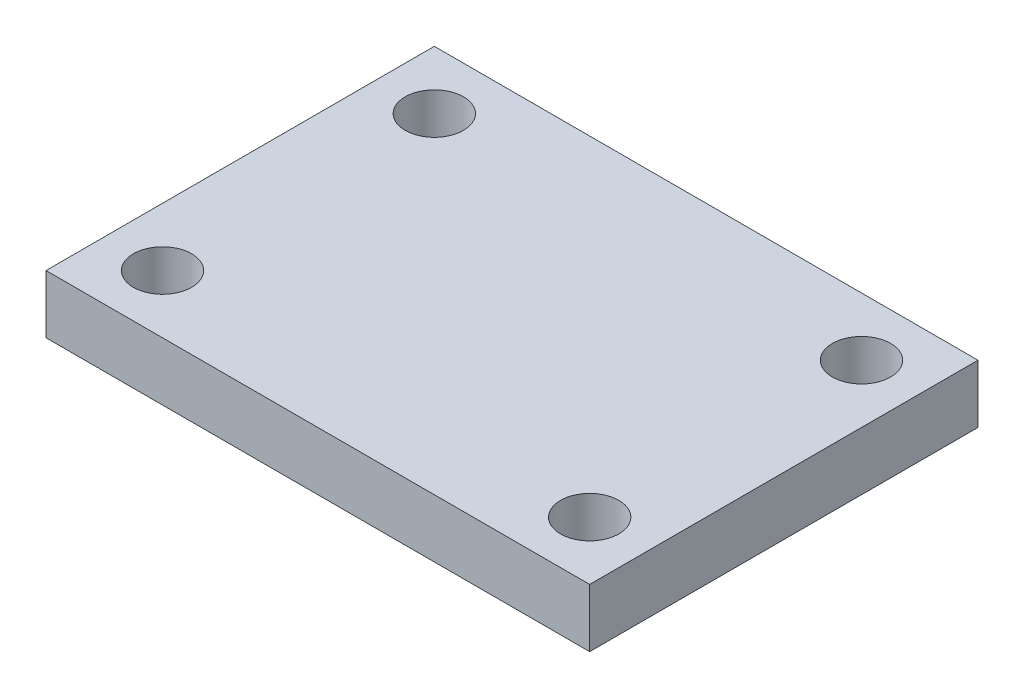
ISO-10303-21;
HEADER;
FILE_DESCRIPTION(('STEP AP214'),'2;1');
FILE_NAME('part.step','',(''),(''),'','','');
FILE_SCHEMA(('AUTOMOTIVE_DESIGN { 1 0 10303 214 1 1 1 1 }'));
ENDSEC;
DATA;
#1=APPLICATION_CONTEXT('core data for automotive mechanical design processes');
#2=APPLICATION_PROTOCOL_DEFINITION('international standard','automotive_design',2000,#1);
#3=PRODUCT_CONTEXT('',#1,'mechanical');
#4=PRODUCT('Part','Part','',(#3));
#5=PRODUCT_RELATED_PRODUCT_CATEGORY('part','',(#4));
#6=PRODUCT_DEFINITION_FORMATION('','',#4);
#7=PRODUCT_DEFINITION_CONTEXT('part definition',#1,'design');
#8=PRODUCT_DEFINITION('design','',#6,#7);
#9=PRODUCT_DEFINITION_SHAPE('','',#8);
#10=(LENGTH_UNIT() NAMED_UNIT(*) SI_UNIT(.MILLI.,.METRE.));
#11=(NAMED_UNIT(*) PLANE_ANGLE_UNIT() SI_UNIT($,.RADIAN.));
#12=(NAMED_UNIT(*) SI_UNIT($,.STERADIAN.) SOLID_ANGLE_UNIT());
#13=UNCERTAINTY_MEASURE_WITH_UNIT(LENGTH_MEASURE(1.E-05),#10,'distance_accuracy_value','');
#14=(GEOMETRIC_REPRESENTATION_CONTEXT(3) GLOBAL_UNCERTAINTY_ASSIGNED_CONTEXT((#13)) GLOBAL_UNIT_ASSIGNED_CONTEXT((#10,
#11,#12)) REPRESENTATION_CONTEXT('',''));
#15=CARTESIAN_POINT('',(0.,0.,0.));
#16=DIRECTION('',(0.,0.,1.));
#17=DIRECTION('',(1.,0.,0.));
#18=AXIS2_PLACEMENT_3D('',#15,#16,#17);
#19=CARTESIAN_POINT('',(0.,3.,0.));
#20=DIRECTION('',(0.,1.,0.));
#21=DIRECTION('',(0.,0.,1.));
#22=AXIS2_PLACEMENT_3D('',#19,#20,#21);
#23=PLANE('',#22);
#24=CARTESIAN_POINT('',(11.,3.,7.));
#25=DIRECTION('',(0.,1.,0.));
#26=DIRECTION('',(0.,0.,-1.));
#27=AXIS2_PLACEMENT_3D('',#24,#25,#26);
#28=CIRCLE('',#27,1.5);
#29=CARTESIAN_POINT('',(11.,3.,5.5));
#30=VERTEX_POINT('',#29);
#31=EDGE_CURVE('E146',#30,#30,#28,.T.);
#32=ORIENTED_EDGE('',*,*,#31,.F.);
#33=EDGE_LOOP('',(#32));
#34=FACE_BOUND('',#33,.T.);
#35=CARTESIAN_POINT('',(-11.,3.,-7.));
#36=DIRECTION('',(0.,1.,0.));
#37=DIRECTION('',(0.,0.,1.));
#38=AXIS2_PLACEMENT_3D('',#35,#36,#37);
#39=CIRCLE('',#38,1.5);
#40=CARTESIAN_POINT('',(-11.,3.,-5.5));
#41=VERTEX_POINT('',#40);
#42=EDGE_CURVE('E116',#41,#41,#39,.T.);
#43=ORIENTED_EDGE('',*,*,#42,.F.);
#44=EDGE_LOOP('',(#43));
#45=FACE_BOUND('',#44,.T.);
#46=DIRECTION('',(0.,0.,1.));
#47=VECTOR('',#46,1.);
#48=CARTESIAN_POINT('',(-14.,3.,10.));
#49=LINE('',#48,#47);
#50=CARTESIAN_POINT('',(-14.,3.,-10.));
#51=VERTEX_POINT('',#50);
#52=CARTESIAN_POINT('',(-14.,3.,10.));
#53=VERTEX_POINT('',#52);
#54=EDGE_CURVE('E96',#51,#53,#49,.T.);
#55=ORIENTED_EDGE('',*,*,#54,.T.);
#56=DIRECTION('',(1.,0.,0.));
#57=VECTOR('',#56,1.);
#58=CARTESIAN_POINT('',(14.,3.,10.));
#59=LINE('',#58,#57);
#60=CARTESIAN_POINT('',(14.,3.,10.));
#61=VERTEX_POINT('',#60);
#62=EDGE_CURVE('E91',#53,#61,#59,.T.);
#63=ORIENTED_EDGE('',*,*,#62,.T.);
#64=DIRECTION('',(0.,0.,-1.));
#65=VECTOR('',#64,1.);
#66=CARTESIAN_POINT('',(14.,3.,10.));
#67=LINE('',#66,#65);
#68=CARTESIAN_POINT('',(14.,3.,-10.));
#69=VERTEX_POINT('',#68);
#70=EDGE_CURVE('E94',#61,#69,#67,.T.);
#71=ORIENTED_EDGE('',*,*,#70,.T.);
#72=DIRECTION('',(-1.,0.,0.));
#73=VECTOR('',#72,1.);
#74=CARTESIAN_POINT('',(14.,3.,-10.));
#75=LINE('',#74,#73);
#76=EDGE_CURVE('E61',#69,#51,#75,.T.);
#77=ORIENTED_EDGE('',*,*,#76,.T.);
#78=EDGE_LOOP('',(#55,#63,#71,#77));
#79=FACE_BOUND('',#78,.T.);
#80=CARTESIAN_POINT('',(-11.,3.,7.));
#81=DIRECTION('',(0.,1.,0.));
#82=DIRECTION('',(0.,0.,1.));
#83=AXIS2_PLACEMENT_3D('',#80,#81,#82);
#84=CIRCLE('',#83,1.5);
#85=CARTESIAN_POINT('',(-11.,3.,8.5));
#86=VERTEX_POINT('',#85);
#87=EDGE_CURVE('E138',#86,#86,#84,.T.);
#88=ORIENTED_EDGE('',*,*,#87,.F.);
#89=EDGE_LOOP('',(#88));
#90=FACE_BOUND('',#89,.T.);
#91=CARTESIAN_POINT('',(11.,3.,-7.));
#92=DIRECTION('',(0.,1.,0.));
#93=DIRECTION('',(0.,0.,-1.));
#94=AXIS2_PLACEMENT_3D('',#91,#92,#93);
#95=CIRCLE('',#94,1.5);
#96=CARTESIAN_POINT('',(11.,3.,-8.5));
#97=VERTEX_POINT('',#96);
#98=EDGE_CURVE('E154',#97,#97,#95,.T.);
#99=ORIENTED_EDGE('',*,*,#98,.F.);
#100=EDGE_LOOP('',(#99));
#101=FACE_BOUND('',#100,.T.);
#102=ADVANCED_FACE('F43',(#34,#45,#79,#90,#101),#23,.T.);
#103=CARTESIAN_POINT('',(0.,0.,0.));
#104=DIRECTION('',(0.,1.,0.));
#105=DIRECTION('',(0.,0.,1.));
#106=AXIS2_PLACEMENT_3D('',#103,#104,#105);
#107=PLANE('',#106);
#108=DIRECTION('',(0.,0.,1.));
#109=VECTOR('',#108,1.);
#110=CARTESIAN_POINT('',(-14.,0.,10.));
#111=LINE('',#110,#109);
#112=CARTESIAN_POINT('',(-14.,0.,-10.));
#113=VERTEX_POINT('',#112);
#114=CARTESIAN_POINT('',(-14.,0.,10.));
#115=VERTEX_POINT('',#114);
#116=EDGE_CURVE('E112',#113,#115,#111,.T.);
#117=ORIENTED_EDGE('',*,*,#116,.F.);
#118=DIRECTION('',(-1.,0.,0.));
#119=VECTOR('',#118,1.);
#120=CARTESIAN_POINT('',(14.,0.,-10.));
#121=LINE('',#120,#119);
#122=CARTESIAN_POINT('',(14.,0.,-10.));
#123=VERTEX_POINT('',#122);
#124=EDGE_CURVE('E84',#123,#113,#121,.T.);
#125=ORIENTED_EDGE('',*,*,#124,.F.);
#126=DIRECTION('',(0.,0.,-1.));
#127=VECTOR('',#126,1.);
#128=CARTESIAN_POINT('',(14.,0.,10.));
#129=LINE('',#128,#127);
#130=CARTESIAN_POINT('',(14.,0.,10.));
#131=VERTEX_POINT('',#130);
#132=EDGE_CURVE('E78',#131,#123,#129,.T.);
#133=ORIENTED_EDGE('',*,*,#132,.F.);
#134=DIRECTION('',(1.,0.,0.));
#135=VECTOR('',#134,1.);
#136=CARTESIAN_POINT('',(14.,0.,10.));
#137=LINE('',#136,#135);
#138=EDGE_CURVE('E101',#115,#131,#137,.T.);
#139=ORIENTED_EDGE('',*,*,#138,.F.);
#140=EDGE_LOOP('',(#117,#125,#133,#139));
#141=FACE_BOUND('',#140,.T.);
#142=CARTESIAN_POINT('',(-11.,0.,-7.));
#143=DIRECTION('',(0.,1.,0.));
#144=DIRECTION('',(0.,0.,1.));
#145=AXIS2_PLACEMENT_3D('',#142,#143,#144);
#146=CIRCLE('',#145,1.5);
#147=CARTESIAN_POINT('',(-11.,0.,-5.5));
#148=VERTEX_POINT('',#147);
#149=EDGE_CURVE('E134',#148,#148,#146,.T.);
#150=ORIENTED_EDGE('',*,*,#149,.T.);
#151=EDGE_LOOP('',(#150));
#152=FACE_BOUND('',#151,.T.);
#153=CARTESIAN_POINT('',(-11.,0.,7.));
#154=DIRECTION('',(0.,1.,0.));
#155=DIRECTION('',(0.,0.,1.));
#156=AXIS2_PLACEMENT_3D('',#153,#154,#155);
#157=CIRCLE('',#156,1.5);
#158=CARTESIAN_POINT('',(-11.,0.,8.5));
#159=VERTEX_POINT('',#158);
#160=EDGE_CURVE('E142',#159,#159,#157,.T.);
#161=ORIENTED_EDGE('',*,*,#160,.T.);
#162=EDGE_LOOP('',(#161));
#163=FACE_BOUND('',#162,.T.);
#164=CARTESIAN_POINT('',(11.,0.,7.));
#165=DIRECTION('',(0.,1.,0.));
#166=DIRECTION('',(0.,0.,-1.));
#167=AXIS2_PLACEMENT_3D('',#164,#165,#166);
#168=CIRCLE('',#167,1.5);
#169=CARTESIAN_POINT('',(11.,0.,5.5));
#170=VERTEX_POINT('',#169);
#171=EDGE_CURVE('E150',#170,#170,#168,.T.);
#172=ORIENTED_EDGE('',*,*,#171,.T.);
#173=EDGE_LOOP('',(#172));
#174=FACE_BOUND('',#173,.T.);
#175=CARTESIAN_POINT('',(11.,0.,-7.));
#176=DIRECTION('',(0.,1.,0.));
#177=DIRECTION('',(0.,0.,-1.));
#178=AXIS2_PLACEMENT_3D('',#175,#176,#177);
#179=CIRCLE('',#178,1.5);
#180=CARTESIAN_POINT('',(11.,0.,-8.5));
#181=VERTEX_POINT('',#180);
#182=EDGE_CURVE('E158',#181,#181,#179,.T.);
#183=ORIENTED_EDGE('',*,*,#182,.T.);
#184=EDGE_LOOP('',(#183));
#185=FACE_BOUND('',#184,.T.);
#186=ADVANCED_FACE('F129',(#141,#152,#163,#174,#185),#107,.F.);
#187=CARTESIAN_POINT('',(-14.,3.,10.));
#188=DIRECTION('',(1.,0.,0.));
#189=DIRECTION('',(0.,0.,-1.));
#190=AXIS2_PLACEMENT_3D('',#187,#188,#189);
#191=PLANE('',#190);
#192=ORIENTED_EDGE('',*,*,#116,.T.);
#193=DIRECTION('',(0.,-1.,0.));
#194=VECTOR('',#193,1.);
#195=CARTESIAN_POINT('',(-14.,3.,10.));
#196=LINE('',#195,#194);
#197=EDGE_CURVE('E11',#53,#115,#196,.T.);
#198=ORIENTED_EDGE('',*,*,#197,.F.);
#199=ORIENTED_EDGE('',*,*,#54,.F.);
#200=DIRECTION('',(0.,-1.,0.));
#201=VECTOR('',#200,1.);
#202=CARTESIAN_POINT('',(-14.,3.,-10.));
#203=LINE('',#202,#201);
#204=EDGE_CURVE('E108',#51,#113,#203,.T.);
#205=ORIENTED_EDGE('',*,*,#204,.T.);
#206=EDGE_LOOP('',(#192,#198,#199,#205));
#207=FACE_BOUND('',#206,.T.);
#208=ADVANCED_FACE('F45',(#207),#191,.F.);
#209=CARTESIAN_POINT('',(14.,3.,10.));
#210=DIRECTION('',(0.,0.,-1.));
#211=DIRECTION('',(-1.,0.,0.));
#212=AXIS2_PLACEMENT_3D('',#209,#210,#211);
#213=PLANE('',#212);
#214=ORIENTED_EDGE('',*,*,#138,.T.);
#215=DIRECTION('',(0.,-1.,0.));
#216=VECTOR('',#215,1.);
#217=CARTESIAN_POINT('',(14.,3.,10.));
#218=LINE('',#217,#216);
#219=EDGE_CURVE('E53',#61,#131,#218,.T.);
#220=ORIENTED_EDGE('',*,*,#219,.F.);
#221=ORIENTED_EDGE('',*,*,#62,.F.);
#222=ORIENTED_EDGE('',*,*,#197,.T.);
#223=EDGE_LOOP('',(#214,#220,#221,#222));
#224=FACE_BOUND('',#223,.T.);
#225=ADVANCED_FACE('F100',(#224),#213,.F.);
#226=CARTESIAN_POINT('',(14.,3.,10.));
#227=DIRECTION('',(-1.,0.,0.));
#228=DIRECTION('',(0.,0.,1.));
#229=AXIS2_PLACEMENT_3D('',#226,#227,#228);
#230=PLANE('',#229);
#231=ORIENTED_EDGE('',*,*,#132,.T.);
#232=DIRECTION('',(0.,-1.,0.));
#233=VECTOR('',#232,1.);
#234=CARTESIAN_POINT('',(14.,3.,-10.));
#235=LINE('',#234,#233);
#236=EDGE_CURVE('E103',#69,#123,#235,.T.);
#237=ORIENTED_EDGE('',*,*,#236,.F.);
#238=ORIENTED_EDGE('',*,*,#70,.F.);
#239=ORIENTED_EDGE('',*,*,#219,.T.);
#240=EDGE_LOOP('',(#231,#237,#238,#239));
#241=FACE_BOUND('',#240,.T.);
#242=ADVANCED_FACE('F104',(#241),#230,.F.);
#243=CARTESIAN_POINT('',(14.,3.,-10.));
#244=DIRECTION('',(0.,0.,1.));
#245=DIRECTION('',(1.,0.,0.));
#246=AXIS2_PLACEMENT_3D('',#243,#244,#245);
#247=PLANE('',#246);
#248=ORIENTED_EDGE('',*,*,#124,.T.);
#249=ORIENTED_EDGE('',*,*,#204,.F.);
#250=ORIENTED_EDGE('',*,*,#76,.F.);
#251=ORIENTED_EDGE('',*,*,#236,.T.);
#252=EDGE_LOOP('',(#248,#249,#250,#251));
#253=FACE_BOUND('',#252,.T.);
#254=ADVANCED_FACE('F126',(#253),#247,.F.);
#255=CARTESIAN_POINT('',(-11.,3.,-7.));
#256=DIRECTION('',(0.,-1.,0.));
#257=DIRECTION('',(0.,0.,-1.));
#258=AXIS2_PLACEMENT_3D('',#255,#256,#257);
#259=CYLINDRICAL_SURFACE('',#258,1.5);
#260=ORIENTED_EDGE('',*,*,#42,.T.);
#261=EDGE_LOOP('',(#260));
#262=FACE_BOUND('',#261,.T.);
#263=ORIENTED_EDGE('',*,*,#149,.F.);
#264=EDGE_LOOP('',(#263));
#265=FACE_BOUND('',#264,.T.);
#266=ADVANCED_FACE('F179',(#262,#265),#259,.F.);
#267=CARTESIAN_POINT('',(-11.,3.,7.));
#268=DIRECTION('',(0.,-1.,0.));
#269=DIRECTION('',(0.,0.,-1.));
#270=AXIS2_PLACEMENT_3D('',#267,#268,#269);
#271=CYLINDRICAL_SURFACE('',#270,1.5);
#272=ORIENTED_EDGE('',*,*,#87,.T.);
#273=EDGE_LOOP('',(#272));
#274=FACE_BOUND('',#273,.T.);
#275=ORIENTED_EDGE('',*,*,#160,.F.);
#276=EDGE_LOOP('',(#275));
#277=FACE_BOUND('',#276,.T.);
#278=ADVANCED_FACE('F233',(#274,#277),#271,.F.);
#279=CARTESIAN_POINT('',(11.,3.,7.));
#280=DIRECTION('',(0.,-1.,0.));
#281=DIRECTION('',(0.,0.,-1.));
#282=AXIS2_PLACEMENT_3D('',#279,#280,#281);
#283=CYLINDRICAL_SURFACE('',#282,1.5);
#284=ORIENTED_EDGE('',*,*,#31,.T.);
#285=EDGE_LOOP('',(#284));
#286=FACE_BOUND('',#285,.T.);
#287=ORIENTED_EDGE('',*,*,#171,.F.);
#288=EDGE_LOOP('',(#287));
#289=FACE_BOUND('',#288,.T.);
#290=ADVANCED_FACE('F242',(#286,#289),#283,.F.);
#291=CARTESIAN_POINT('',(11.,3.,-7.));
#292=DIRECTION('',(0.,-1.,0.));
#293=DIRECTION('',(0.,0.,-1.));
#294=AXIS2_PLACEMENT_3D('',#291,#292,#293);
#295=CYLINDRICAL_SURFACE('',#294,1.5);
#296=ORIENTED_EDGE('',*,*,#98,.T.);
#297=EDGE_LOOP('',(#296));
#298=FACE_BOUND('',#297,.T.);
#299=ORIENTED_EDGE('',*,*,#182,.F.);
#300=EDGE_LOOP('',(#299));
#301=FACE_BOUND('',#300,.T.);
#302=ADVANCED_FACE('F166',(#298,#301),#295,.F.);
#303=CLOSED_SHELL('',(#102,#186,#208,#225,#242,#254,#266,#278,#290,#302));
#304=MANIFOLD_SOLID_BREP('B2',#303);
#305=ADVANCED_BREP_SHAPE_REPRESENTATION('',(#18,#304),#14);
#306=SHAPE_DEFINITION_REPRESENTATION(#9,#305);
ENDSEC;
END-ISO-10303-21;
